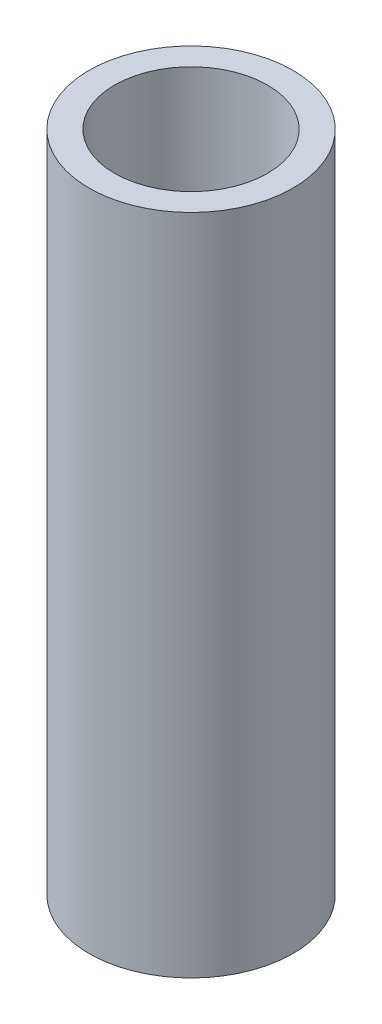
ISO-10303-21;
HEADER;
FILE_DESCRIPTION(('STEP AP214'),'2;1');
FILE_NAME('part.step','',(''),(''),'','','');
FILE_SCHEMA(('AUTOMOTIVE_DESIGN { 1 0 10303 214 1 1 1 1 }'));
ENDSEC;
DATA;
#1=APPLICATION_CONTEXT('core data for automotive mechanical design processes');
#2=APPLICATION_PROTOCOL_DEFINITION('international standard','automotive_design',2000,#1);
#3=PRODUCT_CONTEXT('',#1,'mechanical');
#4=PRODUCT('Part','Part','',(#3));
#5=PRODUCT_RELATED_PRODUCT_CATEGORY('part','',(#4));
#6=PRODUCT_DEFINITION_FORMATION('','',#4);
#7=PRODUCT_DEFINITION_CONTEXT('part definition',#1,'design');
#8=PRODUCT_DEFINITION('design','',#6,#7);
#9=PRODUCT_DEFINITION_SHAPE('','',#8);
#10=(LENGTH_UNIT() NAMED_UNIT(*) SI_UNIT(.MILLI.,.METRE.));
#11=(NAMED_UNIT(*) PLANE_ANGLE_UNIT() SI_UNIT($,.RADIAN.));
#12=(NAMED_UNIT(*) SI_UNIT($,.STERADIAN.) SOLID_ANGLE_UNIT());
#13=UNCERTAINTY_MEASURE_WITH_UNIT(LENGTH_MEASURE(1.E-05),#10,'distance_accuracy_value','');
#14=(GEOMETRIC_REPRESENTATION_CONTEXT(3) GLOBAL_UNCERTAINTY_ASSIGNED_CONTEXT((#13)) GLOBAL_UNIT_ASSIGNED_CONTEXT((#10,
#11,#12)) REPRESENTATION_CONTEXT('',''));
#15=CARTESIAN_POINT('',(0.,0.,0.));
#16=DIRECTION('',(0.,0.,1.));
#17=DIRECTION('',(1.,0.,0.));
#18=AXIS2_PLACEMENT_3D('',#15,#16,#17);
#19=CARTESIAN_POINT('',(0.,26.,0.));
#20=DIRECTION('',(0.,1.,0.));
#21=DIRECTION('',(0.,0.,1.));
#22=AXIS2_PLACEMENT_3D('',#19,#20,#21);
#23=PLANE('',#22);
#24=CARTESIAN_POINT('',(0.,26.,0.));
#25=DIRECTION('',(0.,1.,0.));
#26=DIRECTION('',(0.,0.,1.));
#27=AXIS2_PLACEMENT_3D('',#24,#25,#26);
#28=CIRCLE('',#27,4.);
#29=CARTESIAN_POINT('',(0.,26.,-4.));
#30=VERTEX_POINT('',#29);
#31=EDGE_CURVE('E10',#30,#30,#28,.T.);
#32=ORIENTED_EDGE('',*,*,#31,.T.);
#33=EDGE_LOOP('',(#32));
#34=FACE_BOUND('',#33,.T.);
#35=CARTESIAN_POINT('',(0.,26.,0.));
#36=DIRECTION('',(0.,1.,0.));
#37=DIRECTION('',(0.,0.,1.));
#38=AXIS2_PLACEMENT_3D('',#35,#36,#37);
#39=CIRCLE('',#38,3.);
#40=CARTESIAN_POINT('',(0.,26.,-3.));
#41=VERTEX_POINT('',#40);
#42=EDGE_CURVE('E45',#41,#41,#39,.T.);
#43=ORIENTED_EDGE('',*,*,#42,.F.);
#44=EDGE_LOOP('',(#43));
#45=FACE_BOUND('',#44,.T.);
#46=ADVANCED_FACE('F34',(#34,#45),#23,.T.);
#47=CARTESIAN_POINT('',(0.,0.,0.));
#48=DIRECTION('',(0.,1.,0.));
#49=DIRECTION('',(0.,0.,1.));
#50=AXIS2_PLACEMENT_3D('',#47,#48,#49);
#51=PLANE('',#50);
#52=CARTESIAN_POINT('',(0.,0.,0.));
#53=DIRECTION('',(0.,1.,0.));
#54=DIRECTION('',(0.,0.,1.));
#55=AXIS2_PLACEMENT_3D('',#52,#53,#54);
#56=CIRCLE('',#55,4.);
#57=CARTESIAN_POINT('',(0.,0.,-4.));
#58=VERTEX_POINT('',#57);
#59=EDGE_CURVE('E38',#58,#58,#56,.T.);
#60=ORIENTED_EDGE('',*,*,#59,.F.);
#61=EDGE_LOOP('',(#60));
#62=FACE_BOUND('',#61,.T.);
#63=CARTESIAN_POINT('',(0.,0.,0.));
#64=DIRECTION('',(0.,1.,0.));
#65=DIRECTION('',(0.,0.,1.));
#66=AXIS2_PLACEMENT_3D('',#63,#64,#65);
#67=CIRCLE('',#66,3.);
#68=CARTESIAN_POINT('',(0.,0.,-3.));
#69=VERTEX_POINT('',#68);
#70=EDGE_CURVE('E47',#69,#69,#67,.T.);
#71=ORIENTED_EDGE('',*,*,#70,.T.);
#72=EDGE_LOOP('',(#71));
#73=FACE_BOUND('',#72,.T.);
#74=ADVANCED_FACE('F57',(#62,#73),#51,.F.);
#75=CARTESIAN_POINT('',(0.,26.,0.));
#76=DIRECTION('',(0.,-1.,0.));
#77=DIRECTION('',(0.,0.,-1.));
#78=AXIS2_PLACEMENT_3D('',#75,#76,#77);
#79=CYLINDRICAL_SURFACE('',#78,4.);
#80=CARTESIAN_POINT('',(0.,26.,-4.));
#81=CARTESIAN_POINT('',(0.,25.7291666666667,-4.));
#82=CARTESIAN_POINT('',(0.,25.4583333333333,-4.));
#83=CARTESIAN_POINT('',(0.,24.9166666666667,-4.));
#84=CARTESIAN_POINT('',(0.,24.6458333333333,-4.));
#85=CARTESIAN_POINT('',(0.,24.1041666666667,-4.));
#86=CARTESIAN_POINT('',(0.,23.8333333333333,-4.));
#87=CARTESIAN_POINT('',(0.,23.2916666666667,-4.));
#88=CARTESIAN_POINT('',(0.,23.0208333333333,-4.));
#89=CARTESIAN_POINT('',(0.,22.4791666666667,-4.));
#90=CARTESIAN_POINT('',(0.,22.2083333333333,-4.));
#91=CARTESIAN_POINT('',(0.,21.6666666666667,-4.));
#92=CARTESIAN_POINT('',(0.,21.3958333333333,-4.));
#93=CARTESIAN_POINT('',(0.,20.8541666666667,-4.));
#94=CARTESIAN_POINT('',(0.,20.5833333333333,-4.));
#95=CARTESIAN_POINT('',(0.,20.0416666666667,-4.));
#96=CARTESIAN_POINT('',(0.,19.7708333333333,-4.));
#97=CARTESIAN_POINT('',(0.,19.2291666666667,-4.));
#98=CARTESIAN_POINT('',(0.,18.9583333333333,-4.));
#99=CARTESIAN_POINT('',(0.,18.4166666666667,-4.));
#100=CARTESIAN_POINT('',(0.,18.1458333333333,-4.));
#101=CARTESIAN_POINT('',(0.,17.6041666666667,-4.));
#102=CARTESIAN_POINT('',(0.,17.3333333333333,-4.));
#103=CARTESIAN_POINT('',(0.,16.7916666666667,-4.));
#104=CARTESIAN_POINT('',(0.,16.5208333333333,-4.));
#105=CARTESIAN_POINT('',(0.,15.9791666666667,-4.));
#106=CARTESIAN_POINT('',(0.,15.7083333333333,-4.));
#107=CARTESIAN_POINT('',(0.,15.1666666666667,-4.));
#108=CARTESIAN_POINT('',(0.,14.8958333333333,-4.));
#109=CARTESIAN_POINT('',(0.,14.3541666666667,-4.));
#110=CARTESIAN_POINT('',(0.,14.0833333333333,-4.));
#111=CARTESIAN_POINT('',(0.,13.5416666666667,-4.));
#112=CARTESIAN_POINT('',(0.,13.2708333333333,-4.));
#113=CARTESIAN_POINT('',(0.,12.7291666666667,-4.));
#114=CARTESIAN_POINT('',(0.,12.4583333333333,-4.));
#115=CARTESIAN_POINT('',(0.,11.9166666666667,-4.));
#116=CARTESIAN_POINT('',(0.,11.6458333333333,-4.));
#117=CARTESIAN_POINT('',(0.,11.1041666666667,-4.));
#118=CARTESIAN_POINT('',(0.,10.8333333333333,-4.));
#119=CARTESIAN_POINT('',(0.,10.2916666666667,-4.));
#120=CARTESIAN_POINT('',(0.,10.0208333333333,-4.));
#121=CARTESIAN_POINT('',(0.,9.47916666666667,-4.));
#122=CARTESIAN_POINT('',(0.,9.20833333333333,-4.));
#123=CARTESIAN_POINT('',(0.,8.66666666666667,-4.));
#124=CARTESIAN_POINT('',(0.,8.39583333333333,-4.));
#125=CARTESIAN_POINT('',(0.,7.85416666666667,-4.));
#126=CARTESIAN_POINT('',(0.,7.58333333333333,-4.));
#127=CARTESIAN_POINT('',(0.,7.04166666666667,-4.));
#128=CARTESIAN_POINT('',(0.,6.77083333333333,-4.));
#129=CARTESIAN_POINT('',(0.,6.22916666666667,-4.));
#130=CARTESIAN_POINT('',(0.,5.95833333333333,-4.));
#131=CARTESIAN_POINT('',(0.,5.41666666666667,-4.));
#132=CARTESIAN_POINT('',(0.,5.14583333333333,-4.));
#133=CARTESIAN_POINT('',(0.,4.60416666666667,-4.));
#134=CARTESIAN_POINT('',(0.,4.33333333333333,-4.));
#135=CARTESIAN_POINT('',(0.,3.79166666666667,-4.));
#136=CARTESIAN_POINT('',(0.,3.52083333333333,-4.));
#137=CARTESIAN_POINT('',(0.,2.97916666666667,-4.));
#138=CARTESIAN_POINT('',(0.,2.70833333333333,-4.));
#139=CARTESIAN_POINT('',(0.,2.16666666666667,-4.));
#140=CARTESIAN_POINT('',(0.,1.89583333333333,-4.));
#141=CARTESIAN_POINT('',(0.,1.35416666666667,-4.));
#142=CARTESIAN_POINT('',(0.,1.08333333333333,-4.));
#143=CARTESIAN_POINT('',(0.,0.541666666666667,-4.));
#144=CARTESIAN_POINT('',(0.,0.270833333333334,-4.));
#145=CARTESIAN_POINT('',(0.,0.,-4.));
#146=B_SPLINE_CURVE_WITH_KNOTS('',3,(#80,#81,#82,#83,#84,#85,#86,#87,#88,#89,#90,#91,#92,#93,
#94,#95,#96,#97,#98,#99,#100,#101,#102,#103,#104,#105,#106,#107,#108,#109,#110,#111,#112,#113,
#114,#115,#116,#117,#118,#119,#120,#121,#122,#123,#124,#125,#126,#127,#128,#129,#130,#131,#132,
#133,#134,#135,#136,#137,#138,#139,#140,#141,#142,#143,#144,#145),.UNSPECIFIED.,.F.,.F.,(4,2,2,
2,2,2,2,2,2,2,2,2,2,2,2,2,2,2,2,2,2,2,2,2,2,2,2,2,2,2,2,2,4),(0.,0.812500000000001,1.625,2.4375,
3.25,4.0625,4.875,5.6875,6.5,7.3125,8.125,8.9375,9.75,10.5625,11.375,12.1875,13.,13.8125,14.625,
15.4375,16.25,17.0625,17.875,18.6875,19.5,20.3125,21.125,21.9375,22.75,23.5625,24.375,25.1875,
26.),.UNSPECIFIED.);
#147=EDGE_CURVE('BSEAM36',#30,#58,#146,.T.);
#148=ORIENTED_EDGE('',*,*,#31,.F.);
#149=ORIENTED_EDGE('',*,*,#59,.T.);
#150=ORIENTED_EDGE('',*,*,#147,.T.);
#151=ORIENTED_EDGE('',*,*,#147,.F.);
#152=EDGE_LOOP('',(#148,#150,#149,#151));
#153=FACE_BOUND('',#152,.T.);
#154=ADVANCED_FACE('F36',(#153),#79,.T.);
#155=CARTESIAN_POINT('',(0.,26.,0.));
#156=DIRECTION('',(0.,-1.,0.));
#157=DIRECTION('',(0.,0.,-1.));
#158=AXIS2_PLACEMENT_3D('',#155,#156,#157);
#159=CYLINDRICAL_SURFACE('',#158,3.);
#160=CARTESIAN_POINT('',(0.,26.,-3.));
#161=CARTESIAN_POINT('',(0.,25.7291666666667,-3.));
#162=CARTESIAN_POINT('',(0.,25.4583333333333,-3.));
#163=CARTESIAN_POINT('',(0.,24.9166666666667,-3.));
#164=CARTESIAN_POINT('',(0.,24.6458333333333,-3.));
#165=CARTESIAN_POINT('',(0.,24.1041666666667,-3.));
#166=CARTESIAN_POINT('',(0.,23.8333333333333,-3.));
#167=CARTESIAN_POINT('',(0.,23.2916666666667,-3.));
#168=CARTESIAN_POINT('',(0.,23.0208333333333,-3.));
#169=CARTESIAN_POINT('',(0.,22.4791666666667,-3.));
#170=CARTESIAN_POINT('',(0.,22.2083333333333,-3.));
#171=CARTESIAN_POINT('',(0.,21.6666666666667,-3.));
#172=CARTESIAN_POINT('',(0.,21.3958333333333,-3.));
#173=CARTESIAN_POINT('',(0.,20.8541666666667,-3.));
#174=CARTESIAN_POINT('',(0.,20.5833333333333,-3.));
#175=CARTESIAN_POINT('',(0.,20.0416666666667,-3.));
#176=CARTESIAN_POINT('',(0.,19.7708333333333,-3.));
#177=CARTESIAN_POINT('',(0.,19.2291666666667,-3.));
#178=CARTESIAN_POINT('',(0.,18.9583333333333,-3.));
#179=CARTESIAN_POINT('',(0.,18.4166666666667,-3.));
#180=CARTESIAN_POINT('',(0.,18.1458333333333,-3.));
#181=CARTESIAN_POINT('',(0.,17.6041666666667,-3.));
#182=CARTESIAN_POINT('',(0.,17.3333333333333,-3.));
#183=CARTESIAN_POINT('',(0.,16.7916666666667,-3.));
#184=CARTESIAN_POINT('',(0.,16.5208333333333,-3.));
#185=CARTESIAN_POINT('',(0.,15.9791666666667,-3.));
#186=CARTESIAN_POINT('',(0.,15.7083333333333,-3.));
#187=CARTESIAN_POINT('',(0.,15.1666666666667,-3.));
#188=CARTESIAN_POINT('',(0.,14.8958333333333,-3.));
#189=CARTESIAN_POINT('',(0.,14.3541666666667,-3.));
#190=CARTESIAN_POINT('',(0.,14.0833333333333,-3.));
#191=CARTESIAN_POINT('',(0.,13.5416666666667,-3.));
#192=CARTESIAN_POINT('',(0.,13.2708333333333,-3.));
#193=CARTESIAN_POINT('',(0.,12.7291666666667,-3.));
#194=CARTESIAN_POINT('',(0.,12.4583333333333,-3.));
#195=CARTESIAN_POINT('',(0.,11.9166666666667,-3.));
#196=CARTESIAN_POINT('',(0.,11.6458333333333,-3.));
#197=CARTESIAN_POINT('',(0.,11.1041666666667,-3.));
#198=CARTESIAN_POINT('',(0.,10.8333333333333,-3.));
#199=CARTESIAN_POINT('',(0.,10.2916666666667,-3.));
#200=CARTESIAN_POINT('',(0.,10.0208333333333,-3.));
#201=CARTESIAN_POINT('',(0.,9.47916666666667,-3.));
#202=CARTESIAN_POINT('',(0.,9.20833333333333,-3.));
#203=CARTESIAN_POINT('',(0.,8.66666666666667,-3.));
#204=CARTESIAN_POINT('',(0.,8.39583333333333,-3.));
#205=CARTESIAN_POINT('',(0.,7.85416666666667,-3.));
#206=CARTESIAN_POINT('',(0.,7.58333333333333,-3.));
#207=CARTESIAN_POINT('',(0.,7.04166666666667,-3.));
#208=CARTESIAN_POINT('',(0.,6.77083333333333,-3.));
#209=CARTESIAN_POINT('',(0.,6.22916666666667,-3.));
#210=CARTESIAN_POINT('',(0.,5.95833333333333,-3.));
#211=CARTESIAN_POINT('',(0.,5.41666666666667,-3.));
#212=CARTESIAN_POINT('',(0.,5.14583333333333,-3.));
#213=CARTESIAN_POINT('',(0.,4.60416666666667,-3.));
#214=CARTESIAN_POINT('',(0.,4.33333333333333,-3.));
#215=CARTESIAN_POINT('',(0.,3.79166666666667,-3.));
#216=CARTESIAN_POINT('',(0.,3.52083333333333,-3.));
#217=CARTESIAN_POINT('',(0.,2.97916666666667,-3.));
#218=CARTESIAN_POINT('',(0.,2.70833333333333,-3.));
#219=CARTESIAN_POINT('',(0.,2.16666666666667,-3.));
#220=CARTESIAN_POINT('',(0.,1.89583333333333,-3.));
#221=CARTESIAN_POINT('',(0.,1.35416666666667,-3.));
#222=CARTESIAN_POINT('',(0.,1.08333333333333,-3.));
#223=CARTESIAN_POINT('',(0.,0.541666666666667,-3.));
#224=CARTESIAN_POINT('',(0.,0.270833333333334,-3.));
#225=CARTESIAN_POINT('',(0.,0.,-3.));
#226=B_SPLINE_CURVE_WITH_KNOTS('',3,(#160,#161,#162,#163,#164,#165,#166,#167,#168,#169,#170,
#171,#172,#173,#174,#175,#176,#177,#178,#179,#180,#181,#182,#183,#184,#185,#186,#187,#188,#189,
#190,#191,#192,#193,#194,#195,#196,#197,#198,#199,#200,#201,#202,#203,#204,#205,#206,#207,#208,
#209,#210,#211,#212,#213,#214,#215,#216,#217,#218,#219,#220,#221,#222,#223,#224,#225),
.UNSPECIFIED.,.F.,.F.,(4,2,2,2,2,2,2,2,2,2,2,2,2,2,2,2,2,2,2,2,2,2,2,2,2,2,2,2,2,2,2,2,4),(0.,
0.812500000000001,1.625,2.4375,3.25,4.0625,4.875,5.6875,6.5,7.3125,8.125,8.9375,9.75,10.5625,
11.375,12.1875,13.,13.8125,14.625,15.4375,16.25,17.0625,17.875,18.6875,19.5,20.3125,21.125,
21.9375,22.75,23.5625,24.375,25.1875,26.),.UNSPECIFIED.);
#227=EDGE_CURVE('BSEAM53',#41,#69,#226,.T.);
#228=ORIENTED_EDGE('',*,*,#42,.T.);
#229=ORIENTED_EDGE('',*,*,#70,.F.);
#230=ORIENTED_EDGE('',*,*,#227,.T.);
#231=ORIENTED_EDGE('',*,*,#227,.F.);
#232=EDGE_LOOP('',(#228,#230,#229,#231));
#233=FACE_BOUND('',#232,.T.);
#234=ADVANCED_FACE('F53',(#233),#159,.F.);
#235=CLOSED_SHELL('',(#46,#74,#154,#234));
#236=MANIFOLD_SOLID_BREP('B2',#235);
#237=ADVANCED_BREP_SHAPE_REPRESENTATION('',(#18,#236),#14);
#238=SHAPE_DEFINITION_REPRESENTATION(#9,#237);
ENDSEC;
END-ISO-10303-21;
